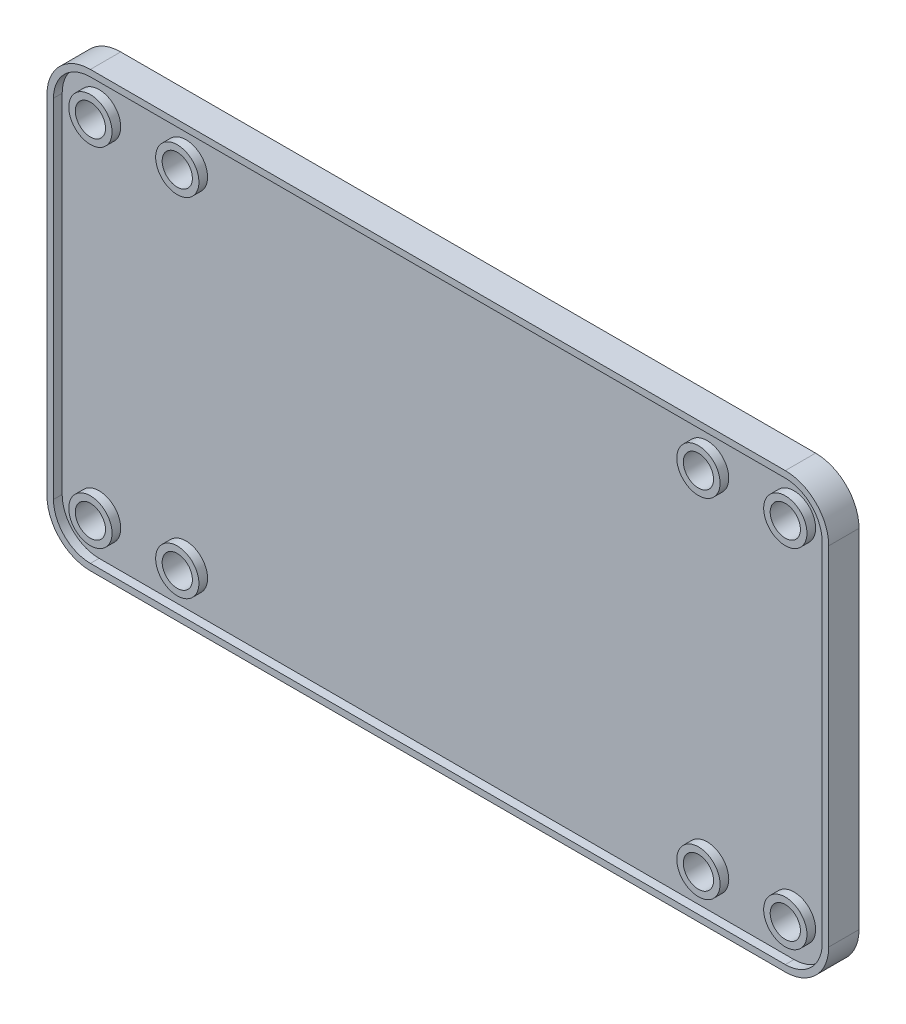
ISO-10303-21;
HEADER;
FILE_DESCRIPTION(('STEP AP214'),'2;1');
FILE_NAME('part.step','',(''),(''),'','','');
FILE_SCHEMA(('AUTOMOTIVE_DESIGN { 1 0 10303 214 1 1 1 1 }'));
ENDSEC;
DATA;
#1=APPLICATION_CONTEXT('core data for automotive mechanical design processes');
#2=APPLICATION_PROTOCOL_DEFINITION('international standard','automotive_design',2000,#1);
#3=PRODUCT_CONTEXT('',#1,'mechanical');
#4=PRODUCT('Part','Part','',(#3));
#5=PRODUCT_RELATED_PRODUCT_CATEGORY('part','',(#4));
#6=PRODUCT_DEFINITION_FORMATION('','',#4);
#7=PRODUCT_DEFINITION_CONTEXT('part definition',#1,'design');
#8=PRODUCT_DEFINITION('design','',#6,#7);
#9=PRODUCT_DEFINITION_SHAPE('','',#8);
#10=(LENGTH_UNIT() NAMED_UNIT(*) SI_UNIT(.MILLI.,.METRE.));
#11=(NAMED_UNIT(*) PLANE_ANGLE_UNIT() SI_UNIT($,.RADIAN.));
#12=(NAMED_UNIT(*) SI_UNIT($,.STERADIAN.) SOLID_ANGLE_UNIT());
#13=UNCERTAINTY_MEASURE_WITH_UNIT(LENGTH_MEASURE(1.E-05),#10,'distance_accuracy_value','');
#14=(GEOMETRIC_REPRESENTATION_CONTEXT(3) GLOBAL_UNCERTAINTY_ASSIGNED_CONTEXT((#13)) GLOBAL_UNIT_ASSIGNED_CONTEXT((#10,
#11,#12)) REPRESENTATION_CONTEXT('',''));
#15=CARTESIAN_POINT('',(0.,0.,0.));
#16=DIRECTION('',(0.,0.,1.));
#17=DIRECTION('',(1.,0.,0.));
#18=AXIS2_PLACEMENT_3D('',#15,#16,#17);
#19=CARTESIAN_POINT('',(50.8,25.4,0.));
#20=DIRECTION('',(0.,0.,-1.));
#21=DIRECTION('',(-1.,0.,0.));
#22=AXIS2_PLACEMENT_3D('',#19,#20,#21);
#23=PLANE('',#22);
#24=CARTESIAN_POINT('',(38.1,25.4,0.));
#25=DIRECTION('',(0.,0.,1.));
#26=DIRECTION('',(1.,0.,0.));
#27=AXIS2_PLACEMENT_3D('',#24,#25,#26);
#28=CIRCLE('',#27,2.2098);
#29=CARTESIAN_POINT('',(40.3098,25.4,0.));
#30=VERTEX_POINT('',#29);
#31=EDGE_CURVE('E313',#30,#30,#28,.T.);
#32=ORIENTED_EDGE('',*,*,#31,.F.);
#33=EDGE_LOOP('',(#32));
#34=FACE_BOUND('',#33,.T.);
#35=CARTESIAN_POINT('',(38.1,25.4,0.));
#36=DIRECTION('',(0.,0.,1.));
#37=DIRECTION('',(1.,0.,0.));
#38=AXIS2_PLACEMENT_3D('',#35,#36,#37);
#39=CIRCLE('',#38,3.1623);
#40=CARTESIAN_POINT('',(41.2623,25.4,0.));
#41=VERTEX_POINT('',#40);
#42=EDGE_CURVE('E237',#41,#41,#39,.T.);
#43=ORIENTED_EDGE('',*,*,#42,.T.);
#44=EDGE_LOOP('',(#43));
#45=FACE_BOUND('',#44,.T.);
#46=ADVANCED_FACE('F45',(#34,#45),#23,.F.);
#47=CARTESIAN_POINT('',(50.8,25.4,0.));
#48=DIRECTION('',(0.,0.,1.));
#49=DIRECTION('',(1.,0.,0.));
#50=AXIS2_PLACEMENT_3D('',#47,#48,#49);
#51=CIRCLE('',#50,2.2098);
#52=CARTESIAN_POINT('',(53.0098,25.4,0.));
#53=VERTEX_POINT('',#52);
#54=EDGE_CURVE('E316',#53,#53,#51,.T.);
#55=ORIENTED_EDGE('',*,*,#54,.F.);
#56=EDGE_LOOP('',(#55));
#57=FACE_BOUND('',#56,.T.);
#58=CARTESIAN_POINT('',(50.8,25.4,0.));
#59=DIRECTION('',(0.,0.,1.));
#60=DIRECTION('',(1.,0.,0.));
#61=AXIS2_PLACEMENT_3D('',#58,#59,#60);
#62=CIRCLE('',#61,3.1623);
#63=CARTESIAN_POINT('',(53.9623,25.4,0.));
#64=VERTEX_POINT('',#63);
#65=EDGE_CURVE('E231',#64,#64,#62,.T.);
#66=ORIENTED_EDGE('',*,*,#65,.T.);
#67=EDGE_LOOP('',(#66));
#68=FACE_BOUND('',#67,.T.);
#69=ADVANCED_FACE('F393',(#57,#68),#23,.F.);
#70=CARTESIAN_POINT('',(50.8,-25.4,0.));
#71=DIRECTION('',(0.,0.,1.));
#72=DIRECTION('',(-1.,0.,0.));
#73=AXIS2_PLACEMENT_3D('',#70,#71,#72);
#74=CIRCLE('',#73,2.2098);
#75=CARTESIAN_POINT('',(48.5902,-25.4,0.));
#76=VERTEX_POINT('',#75);
#77=EDGE_CURVE('E310',#76,#76,#74,.T.);
#78=ORIENTED_EDGE('',*,*,#77,.F.);
#79=EDGE_LOOP('',(#78));
#80=FACE_BOUND('',#79,.T.);
#81=CARTESIAN_POINT('',(50.8,-25.4,0.));
#82=DIRECTION('',(0.,0.,1.));
#83=DIRECTION('',(1.,0.,0.));
#84=AXIS2_PLACEMENT_3D('',#81,#82,#83);
#85=CIRCLE('',#84,3.1623);
#86=CARTESIAN_POINT('',(53.9623,-25.4,0.));
#87=VERTEX_POINT('',#86);
#88=EDGE_CURVE('E225',#87,#87,#85,.T.);
#89=ORIENTED_EDGE('',*,*,#88,.T.);
#90=EDGE_LOOP('',(#89));
#91=FACE_BOUND('',#90,.T.);
#92=ADVANCED_FACE('F399',(#80,#91),#23,.F.);
#93=CARTESIAN_POINT('',(38.1,-25.4,0.));
#94=DIRECTION('',(0.,0.,1.));
#95=DIRECTION('',(-1.,0.,0.));
#96=AXIS2_PLACEMENT_3D('',#93,#94,#95);
#97=CIRCLE('',#96,2.2098);
#98=CARTESIAN_POINT('',(35.8902,-25.4,0.));
#99=VERTEX_POINT('',#98);
#100=EDGE_CURVE('E294',#99,#99,#97,.T.);
#101=ORIENTED_EDGE('',*,*,#100,.F.);
#102=EDGE_LOOP('',(#101));
#103=FACE_BOUND('',#102,.T.);
#104=CARTESIAN_POINT('',(38.1,-25.4,0.));
#105=DIRECTION('',(0.,0.,1.));
#106=DIRECTION('',(1.,0.,0.));
#107=AXIS2_PLACEMENT_3D('',#104,#105,#106);
#108=CIRCLE('',#107,3.1623);
#109=CARTESIAN_POINT('',(41.2623,-25.4,0.));
#110=VERTEX_POINT('',#109);
#111=EDGE_CURVE('E219',#110,#110,#108,.T.);
#112=ORIENTED_EDGE('',*,*,#111,.T.);
#113=EDGE_LOOP('',(#112));
#114=FACE_BOUND('',#113,.T.);
#115=ADVANCED_FACE('F575',(#103,#114),#23,.F.);
#116=CARTESIAN_POINT('',(-38.1,-25.4,0.));
#117=DIRECTION('',(0.,0.,1.));
#118=DIRECTION('',(1.,0.,0.));
#119=AXIS2_PLACEMENT_3D('',#116,#117,#118);
#120=CIRCLE('',#119,2.2098);
#121=CARTESIAN_POINT('',(-35.8902,-25.4,0.));
#122=VERTEX_POINT('',#121);
#123=EDGE_CURVE('E325',#122,#122,#120,.T.);
#124=ORIENTED_EDGE('',*,*,#123,.F.);
#125=EDGE_LOOP('',(#124));
#126=FACE_BOUND('',#125,.T.);
#127=CARTESIAN_POINT('',(-38.1,-25.4,0.));
#128=DIRECTION('',(0.,0.,1.));
#129=DIRECTION('',(1.,0.,0.));
#130=AXIS2_PLACEMENT_3D('',#127,#128,#129);
#131=CIRCLE('',#130,3.1623);
#132=CARTESIAN_POINT('',(-34.9377,-25.4,0.));
#133=VERTEX_POINT('',#132);
#134=EDGE_CURVE('E213',#133,#133,#131,.T.);
#135=ORIENTED_EDGE('',*,*,#134,.T.);
#136=EDGE_LOOP('',(#135));
#137=FACE_BOUND('',#136,.T.);
#138=ADVANCED_FACE('F572',(#126,#137),#23,.F.);
#139=CARTESIAN_POINT('',(-50.8,-25.4,0.));
#140=DIRECTION('',(0.,0.,1.));
#141=DIRECTION('',(1.,0.,0.));
#142=AXIS2_PLACEMENT_3D('',#139,#140,#141);
#143=CIRCLE('',#142,2.2098);
#144=CARTESIAN_POINT('',(-48.5902,-25.4,0.));
#145=VERTEX_POINT('',#144);
#146=EDGE_CURVE('E328',#145,#145,#143,.T.);
#147=ORIENTED_EDGE('',*,*,#146,.F.);
#148=EDGE_LOOP('',(#147));
#149=FACE_BOUND('',#148,.T.);
#150=CARTESIAN_POINT('',(-50.8,-25.4,0.));
#151=DIRECTION('',(0.,0.,1.));
#152=DIRECTION('',(1.,0.,0.));
#153=AXIS2_PLACEMENT_3D('',#150,#151,#152);
#154=CIRCLE('',#153,3.1623);
#155=CARTESIAN_POINT('',(-47.6377,-25.4,0.));
#156=VERTEX_POINT('',#155);
#157=EDGE_CURVE('E207',#156,#156,#154,.T.);
#158=ORIENTED_EDGE('',*,*,#157,.T.);
#159=EDGE_LOOP('',(#158));
#160=FACE_BOUND('',#159,.T.);
#161=ADVANCED_FACE('F423',(#149,#160),#23,.F.);
#162=CARTESIAN_POINT('',(-38.1,25.4,0.));
#163=DIRECTION('',(0.,0.,1.));
#164=DIRECTION('',(-1.,0.,0.));
#165=AXIS2_PLACEMENT_3D('',#162,#163,#164);
#166=CIRCLE('',#165,2.2098);
#167=CARTESIAN_POINT('',(-40.3098,25.4,0.));
#168=VERTEX_POINT('',#167);
#169=EDGE_CURVE('E319',#168,#168,#166,.T.);
#170=ORIENTED_EDGE('',*,*,#169,.F.);
#171=EDGE_LOOP('',(#170));
#172=FACE_BOUND('',#171,.T.);
#173=CARTESIAN_POINT('',(-38.1,25.4,0.));
#174=DIRECTION('',(0.,0.,1.));
#175=DIRECTION('',(1.,0.,0.));
#176=AXIS2_PLACEMENT_3D('',#173,#174,#175);
#177=CIRCLE('',#176,3.1623);
#178=CARTESIAN_POINT('',(-34.9377,25.4,0.));
#179=VERTEX_POINT('',#178);
#180=EDGE_CURVE('E201',#179,#179,#177,.T.);
#181=ORIENTED_EDGE('',*,*,#180,.T.);
#182=EDGE_LOOP('',(#181));
#183=FACE_BOUND('',#182,.T.);
#184=ADVANCED_FACE('F417',(#172,#183),#23,.F.);
#185=CARTESIAN_POINT('',(-50.8,25.4,0.));
#186=DIRECTION('',(0.,0.,1.));
#187=DIRECTION('',(-1.,0.,0.));
#188=AXIS2_PLACEMENT_3D('',#185,#186,#187);
#189=CIRCLE('',#188,2.2098);
#190=CARTESIAN_POINT('',(-53.0098,25.4,0.));
#191=VERTEX_POINT('',#190);
#192=EDGE_CURVE('E322',#191,#191,#189,.T.);
#193=ORIENTED_EDGE('',*,*,#192,.F.);
#194=EDGE_LOOP('',(#193));
#195=FACE_BOUND('',#194,.T.);
#196=CARTESIAN_POINT('',(-50.8,25.4,0.));
#197=DIRECTION('',(0.,0.,1.));
#198=DIRECTION('',(1.,0.,0.));
#199=AXIS2_PLACEMENT_3D('',#196,#197,#198);
#200=CIRCLE('',#199,3.1623);
#201=CARTESIAN_POINT('',(-47.6377,25.4,0.));
#202=VERTEX_POINT('',#201);
#203=EDGE_CURVE('E197',#202,#202,#200,.T.);
#204=ORIENTED_EDGE('',*,*,#203,.T.);
#205=EDGE_LOOP('',(#204));
#206=FACE_BOUND('',#205,.T.);
#207=ADVANCED_FACE('F408',(#195,#206),#23,.F.);
#208=CARTESIAN_POINT('',(50.8,25.4,-3.175));
#209=DIRECTION('',(0.,0.,1.));
#210=DIRECTION('',(1.,0.,0.));
#211=AXIS2_PLACEMENT_3D('',#208,#209,#210);
#212=CYLINDRICAL_SURFACE('',#211,6.35);
#213=CARTESIAN_POINT('',(50.8,25.4,0.));
#214=DIRECTION('',(0.,0.,1.));
#215=DIRECTION('',(-1.,0.,0.));
#216=AXIS2_PLACEMENT_3D('',#213,#214,#215);
#217=CIRCLE('',#216,6.35);
#218=CARTESIAN_POINT('',(57.15,25.4,0.));
#219=VERTEX_POINT('',#218);
#220=CARTESIAN_POINT('',(50.8,31.75,0.));
#221=VERTEX_POINT('',#220);
#222=EDGE_CURVE('E161',#219,#221,#217,.T.);
#223=ORIENTED_EDGE('',*,*,#222,.F.);
#224=DIRECTION('',(0.,0.,1.));
#225=VECTOR('',#224,1.);
#226=CARTESIAN_POINT('',(57.15,25.4,-3.175));
#227=LINE('',#226,#225);
#228=CARTESIAN_POINT('',(57.15,25.4,-4.428000034));
#229=VERTEX_POINT('',#228);
#230=EDGE_CURVE('E11',#229,#219,#227,.T.);
#231=ORIENTED_EDGE('',*,*,#230,.F.);
#232=CARTESIAN_POINT('',(50.8,25.4,-4.428000034));
#233=DIRECTION('',(0.,0.,-1.));
#234=DIRECTION('',(-1.,0.,0.));
#235=AXIS2_PLACEMENT_3D('',#232,#233,#234);
#236=CIRCLE('',#235,6.35);
#237=CARTESIAN_POINT('',(50.8,31.75,-4.428000034));
#238=VERTEX_POINT('',#237);
#239=EDGE_CURVE('E159',#238,#229,#236,.T.);
#240=ORIENTED_EDGE('',*,*,#239,.F.);
#241=DIRECTION('',(0.,0.,1.));
#242=VECTOR('',#241,1.);
#243=CARTESIAN_POINT('',(50.8,31.75,-3.175));
#244=LINE('',#243,#242);
#245=EDGE_CURVE('E49',#238,#221,#244,.T.);
#246=ORIENTED_EDGE('',*,*,#245,.T.);
#247=EDGE_LOOP('',(#223,#231,#240,#246));
#248=FACE_BOUND('',#247,.T.);
#249=ADVANCED_FACE('F47',(#248),#212,.T.);
#250=CARTESIAN_POINT('',(57.15,-25.4,-3.175));
#251=DIRECTION('',(1.,0.,0.));
#252=DIRECTION('',(0.,0.,-1.));
#253=AXIS2_PLACEMENT_3D('',#250,#251,#252);
#254=PLANE('',#253);
#255=DIRECTION('',(0.,1.,0.));
#256=VECTOR('',#255,1.);
#257=CARTESIAN_POINT('',(57.15,-25.4,0.));
#258=LINE('',#257,#256);
#259=CARTESIAN_POINT('',(57.15,-25.4,0.));
#260=VERTEX_POINT('',#259);
#261=EDGE_CURVE('E350',#260,#219,#258,.T.);
#262=ORIENTED_EDGE('',*,*,#261,.F.);
#263=DIRECTION('',(0.,0.,1.));
#264=VECTOR('',#263,1.);
#265=CARTESIAN_POINT('',(57.15,-25.4,-3.175));
#266=LINE('',#265,#264);
#267=CARTESIAN_POINT('',(57.15,-25.4,-4.428000034));
#268=VERTEX_POINT('',#267);
#269=EDGE_CURVE('E54',#268,#260,#266,.T.);
#270=ORIENTED_EDGE('',*,*,#269,.F.);
#271=DIRECTION('',(0.,-1.,0.));
#272=VECTOR('',#271,1.);
#273=CARTESIAN_POINT('',(57.15,25.4,-4.428000034));
#274=LINE('',#273,#272);
#275=EDGE_CURVE('E164',#229,#268,#274,.T.);
#276=ORIENTED_EDGE('',*,*,#275,.F.);
#277=ORIENTED_EDGE('',*,*,#230,.T.);
#278=EDGE_LOOP('',(#262,#270,#276,#277));
#279=FACE_BOUND('',#278,.T.);
#280=ADVANCED_FACE('F165',(#279),#254,.T.);
#281=CARTESIAN_POINT('',(50.8,-25.4,-3.175));
#282=DIRECTION('',(0.,0.,1.));
#283=DIRECTION('',(1.,0.,0.));
#284=AXIS2_PLACEMENT_3D('',#281,#282,#283);
#285=CYLINDRICAL_SURFACE('',#284,6.35);
#286=CARTESIAN_POINT('',(50.8,-25.4,0.));
#287=DIRECTION('',(0.,0.,1.));
#288=DIRECTION('',(1.,0.,0.));
#289=AXIS2_PLACEMENT_3D('',#286,#287,#288);
#290=CIRCLE('',#289,6.35);
#291=CARTESIAN_POINT('',(50.8,-31.75,0.));
#292=VERTEX_POINT('',#291);
#293=EDGE_CURVE('E347',#292,#260,#290,.T.);
#294=ORIENTED_EDGE('',*,*,#293,.F.);
#295=DIRECTION('',(0.,0.,1.));
#296=VECTOR('',#295,1.);
#297=CARTESIAN_POINT('',(50.8,-31.75,-3.175));
#298=LINE('',#297,#296);
#299=CARTESIAN_POINT('',(50.8,-31.75,-4.428000034));
#300=VERTEX_POINT('',#299);
#301=EDGE_CURVE('E353',#300,#292,#298,.T.);
#302=ORIENTED_EDGE('',*,*,#301,.F.);
#303=CARTESIAN_POINT('',(50.8,-25.4,-4.428000034));
#304=DIRECTION('',(0.,0.,-1.));
#305=DIRECTION('',(-1.,0.,0.));
#306=AXIS2_PLACEMENT_3D('',#303,#304,#305);
#307=CIRCLE('',#306,6.35);
#308=EDGE_CURVE('E169',#268,#300,#307,.T.);
#309=ORIENTED_EDGE('',*,*,#308,.F.);
#310=ORIENTED_EDGE('',*,*,#269,.T.);
#311=EDGE_LOOP('',(#294,#302,#309,#310));
#312=FACE_BOUND('',#311,.T.);
#313=ADVANCED_FACE('F370',(#312),#285,.T.);
#314=CARTESIAN_POINT('',(-50.7999999999999,-31.75,-3.175));
#315=DIRECTION('',(0.,-1.,0.));
#316=DIRECTION('',(0.,0.,-1.));
#317=AXIS2_PLACEMENT_3D('',#314,#315,#316);
#318=PLANE('',#317);
#319=DIRECTION('',(1.,0.,0.));
#320=VECTOR('',#319,1.);
#321=CARTESIAN_POINT('',(-50.7999999999999,-31.75,0.));
#322=LINE('',#321,#320);
#323=CARTESIAN_POINT('',(-50.7999999999999,-31.75,0.));
#324=VERTEX_POINT('',#323);
#325=EDGE_CURVE('E344',#324,#292,#322,.T.);
#326=ORIENTED_EDGE('',*,*,#325,.F.);
#327=DIRECTION('',(0.,0.,1.));
#328=VECTOR('',#327,1.);
#329=CARTESIAN_POINT('',(-50.7999999999999,-31.75,-3.175));
#330=LINE('',#329,#328);
#331=CARTESIAN_POINT('',(-50.7999999999999,-31.75,-4.428000034));
#332=VERTEX_POINT('',#331);
#333=EDGE_CURVE('E355',#332,#324,#330,.T.);
#334=ORIENTED_EDGE('',*,*,#333,.F.);
#335=DIRECTION('',(-1.,0.,0.));
#336=VECTOR('',#335,1.);
#337=CARTESIAN_POINT('',(50.8,-31.75,-4.428000034));
#338=LINE('',#337,#336);
#339=EDGE_CURVE('E185',#300,#332,#338,.T.);
#340=ORIENTED_EDGE('',*,*,#339,.F.);
#341=ORIENTED_EDGE('',*,*,#301,.T.);
#342=EDGE_LOOP('',(#326,#334,#340,#341));
#343=FACE_BOUND('',#342,.T.);
#344=ADVANCED_FACE('F374',(#343),#318,.T.);
#345=CARTESIAN_POINT('',(-50.8,-25.4,-3.175));
#346=DIRECTION('',(0.,0.,1.));
#347=DIRECTION('',(1.,0.,0.));
#348=AXIS2_PLACEMENT_3D('',#345,#346,#347);
#349=CYLINDRICAL_SURFACE('',#348,6.35);
#350=CARTESIAN_POINT('',(-50.8,-25.4,0.));
#351=DIRECTION('',(0.,0.,1.));
#352=DIRECTION('',(-1.,0.,0.));
#353=AXIS2_PLACEMENT_3D('',#350,#351,#352);
#354=CIRCLE('',#353,6.35);
#355=CARTESIAN_POINT('',(-57.15,-25.4,0.));
#356=VERTEX_POINT('',#355);
#357=EDGE_CURVE('E341',#356,#324,#354,.T.);
#358=ORIENTED_EDGE('',*,*,#357,.F.);
#359=DIRECTION('',(0.,0.,1.));
#360=VECTOR('',#359,1.);
#361=CARTESIAN_POINT('',(-57.15,-25.4,-3.175));
#362=LINE('',#361,#360);
#363=CARTESIAN_POINT('',(-57.15,-25.4,-4.428000034));
#364=VERTEX_POINT('',#363);
#365=EDGE_CURVE('E357',#364,#356,#362,.T.);
#366=ORIENTED_EDGE('',*,*,#365,.F.);
#367=CARTESIAN_POINT('',(-50.8,-25.4,-4.428000034));
#368=DIRECTION('',(0.,0.,-1.));
#369=DIRECTION('',(-1.,0.,0.));
#370=AXIS2_PLACEMENT_3D('',#367,#368,#369);
#371=CIRCLE('',#370,6.35);
#372=EDGE_CURVE('E188',#332,#364,#371,.T.);
#373=ORIENTED_EDGE('',*,*,#372,.F.);
#374=ORIENTED_EDGE('',*,*,#333,.T.);
#375=EDGE_LOOP('',(#358,#366,#373,#374));
#376=FACE_BOUND('',#375,.T.);
#377=ADVANCED_FACE('F377',(#376),#349,.T.);
#378=CARTESIAN_POINT('',(-57.15,-25.4,-3.175));
#379=DIRECTION('',(-1.,0.,0.));
#380=DIRECTION('',(0.,0.,1.));
#381=AXIS2_PLACEMENT_3D('',#378,#379,#380);
#382=PLANE('',#381);
#383=DIRECTION('',(0.,-1.,0.));
#384=VECTOR('',#383,1.);
#385=CARTESIAN_POINT('',(-57.15,-25.4,0.));
#386=LINE('',#385,#384);
#387=CARTESIAN_POINT('',(-57.15,25.4,0.));
#388=VERTEX_POINT('',#387);
#389=EDGE_CURVE('E338',#388,#356,#386,.T.);
#390=ORIENTED_EDGE('',*,*,#389,.F.);
#391=DIRECTION('',(0.,0.,1.));
#392=VECTOR('',#391,1.);
#393=CARTESIAN_POINT('',(-57.15,25.4,-3.175));
#394=LINE('',#393,#392);
#395=CARTESIAN_POINT('',(-57.15,25.4,-4.428000034));
#396=VERTEX_POINT('',#395);
#397=EDGE_CURVE('E359',#396,#388,#394,.T.);
#398=ORIENTED_EDGE('',*,*,#397,.F.);
#399=DIRECTION('',(0.,1.,0.));
#400=VECTOR('',#399,1.);
#401=CARTESIAN_POINT('',(-57.15,-25.4,-4.428000034));
#402=LINE('',#401,#400);
#403=EDGE_CURVE('E191',#364,#396,#402,.T.);
#404=ORIENTED_EDGE('',*,*,#403,.F.);
#405=ORIENTED_EDGE('',*,*,#365,.T.);
#406=EDGE_LOOP('',(#390,#398,#404,#405));
#407=FACE_BOUND('',#406,.T.);
#408=ADVANCED_FACE('F382',(#407),#382,.T.);
#409=CARTESIAN_POINT('',(-50.8,25.4,-3.175));
#410=DIRECTION('',(0.,0.,1.));
#411=DIRECTION('',(1.,0.,0.));
#412=AXIS2_PLACEMENT_3D('',#409,#410,#411);
#413=CYLINDRICAL_SURFACE('',#412,6.35);
#414=CARTESIAN_POINT('',(-50.8,25.4,0.));
#415=DIRECTION('',(0.,0.,1.));
#416=DIRECTION('',(-1.,0.,0.));
#417=AXIS2_PLACEMENT_3D('',#414,#415,#416);
#418=CIRCLE('',#417,6.35);
#419=CARTESIAN_POINT('',(-50.7999999999999,31.75,0.));
#420=VERTEX_POINT('',#419);
#421=EDGE_CURVE('E335',#420,#388,#418,.T.);
#422=ORIENTED_EDGE('',*,*,#421,.F.);
#423=DIRECTION('',(0.,0.,1.));
#424=VECTOR('',#423,1.);
#425=CARTESIAN_POINT('',(-50.7999999999999,31.75,-3.175));
#426=LINE('',#425,#424);
#427=CARTESIAN_POINT('',(-50.7999999999999,31.75,-4.428000034));
#428=VERTEX_POINT('',#427);
#429=EDGE_CURVE('E360',#428,#420,#426,.T.);
#430=ORIENTED_EDGE('',*,*,#429,.F.);
#431=CARTESIAN_POINT('',(-50.8,25.4,-4.428000034));
#432=DIRECTION('',(0.,0.,-1.));
#433=DIRECTION('',(-1.,0.,0.));
#434=AXIS2_PLACEMENT_3D('',#431,#432,#433);
#435=CIRCLE('',#434,6.35);
#436=EDGE_CURVE('E194',#396,#428,#435,.T.);
#437=ORIENTED_EDGE('',*,*,#436,.F.);
#438=ORIENTED_EDGE('',*,*,#397,.T.);
#439=EDGE_LOOP('',(#422,#430,#437,#438));
#440=FACE_BOUND('',#439,.T.);
#441=ADVANCED_FACE('F384',(#440),#413,.T.);
#442=CARTESIAN_POINT('',(-50.7999999999999,31.75,-3.175));
#443=DIRECTION('',(0.,1.,0.));
#444=DIRECTION('',(0.,0.,1.));
#445=AXIS2_PLACEMENT_3D('',#442,#443,#444);
#446=PLANE('',#445);
#447=DIRECTION('',(-1.,0.,0.));
#448=VECTOR('',#447,1.);
#449=CARTESIAN_POINT('',(-50.7999999999999,31.75,0.));
#450=LINE('',#449,#448);
#451=EDGE_CURVE('E332',#221,#420,#450,.T.);
#452=ORIENTED_EDGE('',*,*,#451,.F.);
#453=ORIENTED_EDGE('',*,*,#245,.F.);
#454=DIRECTION('',(1.,0.,0.));
#455=VECTOR('',#454,1.);
#456=CARTESIAN_POINT('',(-50.7999999999999,31.75,-4.428000034));
#457=LINE('',#456,#455);
#458=EDGE_CURVE('E176',#428,#238,#457,.T.);
#459=ORIENTED_EDGE('',*,*,#458,.F.);
#460=ORIENTED_EDGE('',*,*,#429,.T.);
#461=EDGE_LOOP('',(#452,#453,#459,#460));
#462=FACE_BOUND('',#461,.T.);
#463=ADVANCED_FACE('F364',(#462),#446,.T.);
#464=DIRECTION('',(-1.,0.,0.));
#465=VECTOR('',#464,1.);
#466=CARTESIAN_POINT('',(50.8,30.7975,0.));
#467=LINE('',#466,#465);
#468=CARTESIAN_POINT('',(50.8,30.7975,0.));
#469=VERTEX_POINT('',#468);
#470=CARTESIAN_POINT('',(-50.7999999999999,30.7975,0.));
#471=VERTEX_POINT('',#470);
#472=EDGE_CURVE('E272',#469,#471,#467,.T.);
#473=ORIENTED_EDGE('',*,*,#472,.F.);
#474=CARTESIAN_POINT('',(50.8,25.4,0.));
#475=DIRECTION('',(0.,0.,1.));
#476=DIRECTION('',(1.,0.,0.));
#477=AXIS2_PLACEMENT_3D('',#474,#475,#476);
#478=CIRCLE('',#477,5.3975);
#479=CARTESIAN_POINT('',(56.1975,25.4,0.));
#480=VERTEX_POINT('',#479);
#481=EDGE_CURVE('E62',#480,#469,#478,.T.);
#482=ORIENTED_EDGE('',*,*,#481,.F.);
#483=DIRECTION('',(0.,1.,0.));
#484=VECTOR('',#483,1.);
#485=CARTESIAN_POINT('',(56.1975,-25.4,0.));
#486=LINE('',#485,#484);
#487=CARTESIAN_POINT('',(56.1975,-25.4,0.));
#488=VERTEX_POINT('',#487);
#489=EDGE_CURVE('E249',#488,#480,#486,.T.);
#490=ORIENTED_EDGE('',*,*,#489,.F.);
#491=CARTESIAN_POINT('',(50.8,-25.4,0.));
#492=DIRECTION('',(0.,0.,1.));
#493=DIRECTION('',(1.,0.,0.));
#494=AXIS2_PLACEMENT_3D('',#491,#492,#493);
#495=CIRCLE('',#494,5.3975);
#496=CARTESIAN_POINT('',(50.7999999999999,-30.7975,0.));
#497=VERTEX_POINT('',#496);
#498=EDGE_CURVE('E287',#497,#488,#495,.T.);
#499=ORIENTED_EDGE('',*,*,#498,.F.);
#500=DIRECTION('',(1.,0.,0.));
#501=VECTOR('',#500,1.);
#502=CARTESIAN_POINT('',(-50.8,-30.7975,0.));
#503=LINE('',#502,#501);
#504=CARTESIAN_POINT('',(-50.8,-30.7975,0.));
#505=VERTEX_POINT('',#504);
#506=EDGE_CURVE('E284',#505,#497,#503,.T.);
#507=ORIENTED_EDGE('',*,*,#506,.F.);
#508=CARTESIAN_POINT('',(-50.8,-25.4,0.));
#509=DIRECTION('',(0.,0.,1.));
#510=DIRECTION('',(1.,0.,0.));
#511=AXIS2_PLACEMENT_3D('',#508,#509,#510);
#512=CIRCLE('',#511,5.39749999999999);
#513=CARTESIAN_POINT('',(-56.1975,-25.3999999999999,0.));
#514=VERTEX_POINT('',#513);
#515=EDGE_CURVE('E281',#514,#505,#512,.T.);
#516=ORIENTED_EDGE('',*,*,#515,.F.);
#517=DIRECTION('',(0.,-1.,0.));
#518=VECTOR('',#517,1.);
#519=CARTESIAN_POINT('',(-56.1975,25.4,0.));
#520=LINE('',#519,#518);
#521=CARTESIAN_POINT('',(-56.1975,25.4,0.));
#522=VERTEX_POINT('',#521);
#523=EDGE_CURVE('E278',#522,#514,#520,.T.);
#524=ORIENTED_EDGE('',*,*,#523,.F.);
#525=CARTESIAN_POINT('',(-50.8,25.4,0.));
#526=DIRECTION('',(0.,0.,1.));
#527=DIRECTION('',(1.,0.,0.));
#528=AXIS2_PLACEMENT_3D('',#525,#526,#527);
#529=CIRCLE('',#528,5.3975);
#530=EDGE_CURVE('E275',#471,#522,#529,.T.);
#531=ORIENTED_EDGE('',*,*,#530,.F.);
#532=EDGE_LOOP('',(#473,#482,#490,#499,#507,#516,#524,#531));
#533=FACE_BOUND('',#532,.T.);
#534=ORIENTED_EDGE('',*,*,#222,.T.);
#535=ORIENTED_EDGE('',*,*,#451,.T.);
#536=ORIENTED_EDGE('',*,*,#421,.T.);
#537=ORIENTED_EDGE('',*,*,#389,.T.);
#538=ORIENTED_EDGE('',*,*,#357,.T.);
#539=ORIENTED_EDGE('',*,*,#325,.T.);
#540=ORIENTED_EDGE('',*,*,#293,.T.);
#541=ORIENTED_EDGE('',*,*,#261,.T.);
#542=EDGE_LOOP('',(#534,#535,#536,#537,#538,#539,#540,#541));
#543=FACE_BOUND('',#542,.T.);
#544=ADVANCED_FACE('F366',(#533,#543),#23,.F.);
#545=CARTESIAN_POINT('',(-50.8,-25.4,-3.175));
#546=DIRECTION('',(0.,0.,1.));
#547=DIRECTION('',(1.,0.,0.));
#548=AXIS2_PLACEMENT_3D('',#545,#546,#547);
#549=CYLINDRICAL_SURFACE('',#548,2.2098);
#550=ORIENTED_EDGE('',*,*,#146,.T.);
#551=EDGE_LOOP('',(#550));
#552=FACE_BOUND('',#551,.T.);
#553=CARTESIAN_POINT('',(-50.8,-25.4,-4.428000034));
#554=DIRECTION('',(0.,0.,-1.));
#555=DIRECTION('',(-1.,0.,0.));
#556=AXIS2_PLACEMENT_3D('',#553,#554,#555);
#557=CIRCLE('',#556,2.2098);
#558=CARTESIAN_POINT('',(-53.0098,-25.4,-4.428000034));
#559=VERTEX_POINT('',#558);
#560=EDGE_CURVE('E535',#559,#559,#557,.T.);
#561=ORIENTED_EDGE('',*,*,#560,.T.);
#562=EDGE_LOOP('',(#561));
#563=FACE_BOUND('',#562,.T.);
#564=ADVANCED_FACE('F406',(#552,#563),#549,.F.);
#565=CARTESIAN_POINT('',(-38.1,-25.4,-3.175));
#566=DIRECTION('',(0.,0.,1.));
#567=DIRECTION('',(1.,0.,0.));
#568=AXIS2_PLACEMENT_3D('',#565,#566,#567);
#569=CYLINDRICAL_SURFACE('',#568,2.2098);
#570=ORIENTED_EDGE('',*,*,#123,.T.);
#571=EDGE_LOOP('',(#570));
#572=FACE_BOUND('',#571,.T.);
#573=CARTESIAN_POINT('',(-38.1,-25.4,-4.428000034));
#574=DIRECTION('',(0.,0.,-1.));
#575=DIRECTION('',(-1.,0.,0.));
#576=AXIS2_PLACEMENT_3D('',#573,#574,#575);
#577=CIRCLE('',#576,2.2098);
#578=CARTESIAN_POINT('',(-40.3098,-25.4,-4.428000034));
#579=VERTEX_POINT('',#578);
#580=EDGE_CURVE('E533',#579,#579,#577,.T.);
#581=ORIENTED_EDGE('',*,*,#580,.T.);
#582=EDGE_LOOP('',(#581));
#583=FACE_BOUND('',#582,.T.);
#584=ADVANCED_FACE('F414',(#572,#583),#569,.F.);
#585=CARTESIAN_POINT('',(-50.8,25.4,-3.175));
#586=DIRECTION('',(0.,0.,1.));
#587=DIRECTION('',(1.,0.,0.));
#588=AXIS2_PLACEMENT_3D('',#585,#586,#587);
#589=CYLINDRICAL_SURFACE('',#588,2.2098);
#590=ORIENTED_EDGE('',*,*,#192,.T.);
#591=EDGE_LOOP('',(#590));
#592=FACE_BOUND('',#591,.T.);
#593=CARTESIAN_POINT('',(-50.8,25.4,-4.428000034));
#594=DIRECTION('',(0.,0.,-1.));
#595=DIRECTION('',(-1.,0.,0.));
#596=AXIS2_PLACEMENT_3D('',#593,#594,#595);
#597=CIRCLE('',#596,2.2098);
#598=CARTESIAN_POINT('',(-53.0098,25.4,-4.428000034));
#599=VERTEX_POINT('',#598);
#600=EDGE_CURVE('E539',#599,#599,#597,.T.);
#601=ORIENTED_EDGE('',*,*,#600,.T.);
#602=EDGE_LOOP('',(#601));
#603=FACE_BOUND('',#602,.T.);
#604=ADVANCED_FACE('F520',(#592,#603),#589,.F.);
#605=CARTESIAN_POINT('',(-38.1,25.4,-3.175));
#606=DIRECTION('',(0.,0.,1.));
#607=DIRECTION('',(1.,0.,0.));
#608=AXIS2_PLACEMENT_3D('',#605,#606,#607);
#609=CYLINDRICAL_SURFACE('',#608,2.2098);
#610=ORIENTED_EDGE('',*,*,#169,.T.);
#611=EDGE_LOOP('',(#610));
#612=FACE_BOUND('',#611,.T.);
#613=CARTESIAN_POINT('',(-38.1,25.4,-4.428000034));
#614=DIRECTION('',(0.,0.,-1.));
#615=DIRECTION('',(-1.,0.,0.));
#616=AXIS2_PLACEMENT_3D('',#613,#614,#615);
#617=CIRCLE('',#616,2.2098);
#618=CARTESIAN_POINT('',(-40.3098,25.4,-4.428000034));
#619=VERTEX_POINT('',#618);
#620=EDGE_CURVE('E544',#619,#619,#617,.T.);
#621=ORIENTED_EDGE('',*,*,#620,.T.);
#622=EDGE_LOOP('',(#621));
#623=FACE_BOUND('',#622,.T.);
#624=ADVANCED_FACE('F516',(#612,#623),#609,.F.);
#625=CARTESIAN_POINT('',(50.8,25.4,-3.175));
#626=DIRECTION('',(0.,0.,1.));
#627=DIRECTION('',(1.,0.,0.));
#628=AXIS2_PLACEMENT_3D('',#625,#626,#627);
#629=CYLINDRICAL_SURFACE('',#628,2.2098);
#630=ORIENTED_EDGE('',*,*,#54,.T.);
#631=EDGE_LOOP('',(#630));
#632=FACE_BOUND('',#631,.T.);
#633=CARTESIAN_POINT('',(50.8,25.4,-4.428000034));
#634=DIRECTION('',(0.,0.,-1.));
#635=DIRECTION('',(-1.,0.,0.));
#636=AXIS2_PLACEMENT_3D('',#633,#634,#635);
#637=CIRCLE('',#636,2.2098);
#638=CARTESIAN_POINT('',(48.5902,25.4,-4.428000034));
#639=VERTEX_POINT('',#638);
#640=EDGE_CURVE('E550',#639,#639,#637,.T.);
#641=ORIENTED_EDGE('',*,*,#640,.T.);
#642=EDGE_LOOP('',(#641));
#643=FACE_BOUND('',#642,.T.);
#644=ADVANCED_FACE('F512',(#632,#643),#629,.F.);
#645=CARTESIAN_POINT('',(38.1,25.4,-3.175));
#646=DIRECTION('',(0.,0.,1.));
#647=DIRECTION('',(1.,0.,0.));
#648=AXIS2_PLACEMENT_3D('',#645,#646,#647);
#649=CYLINDRICAL_SURFACE('',#648,2.2098);
#650=ORIENTED_EDGE('',*,*,#31,.T.);
#651=EDGE_LOOP('',(#650));
#652=FACE_BOUND('',#651,.T.);
#653=CARTESIAN_POINT('',(38.1,25.4,-4.428000034));
#654=DIRECTION('',(0.,0.,-1.));
#655=DIRECTION('',(-1.,0.,0.));
#656=AXIS2_PLACEMENT_3D('',#653,#654,#655);
#657=CIRCLE('',#656,2.2098);
#658=CARTESIAN_POINT('',(35.8902,25.4,-4.428000034));
#659=VERTEX_POINT('',#658);
#660=EDGE_CURVE('E547',#659,#659,#657,.T.);
#661=ORIENTED_EDGE('',*,*,#660,.T.);
#662=EDGE_LOOP('',(#661));
#663=FACE_BOUND('',#662,.T.);
#664=ADVANCED_FACE('F508',(#652,#663),#649,.F.);
#665=CARTESIAN_POINT('',(50.8,-25.4,-3.175));
#666=DIRECTION('',(0.,0.,1.));
#667=DIRECTION('',(1.,0.,0.));
#668=AXIS2_PLACEMENT_3D('',#665,#666,#667);
#669=CYLINDRICAL_SURFACE('',#668,2.2098);
#670=ORIENTED_EDGE('',*,*,#77,.T.);
#671=EDGE_LOOP('',(#670));
#672=FACE_BOUND('',#671,.T.);
#673=CARTESIAN_POINT('',(50.8,-25.4,-4.428000034));
#674=DIRECTION('',(0.,0.,-1.));
#675=DIRECTION('',(-1.,0.,0.));
#676=AXIS2_PLACEMENT_3D('',#673,#674,#675);
#677=CIRCLE('',#676,2.2098);
#678=CARTESIAN_POINT('',(48.5902,-25.4,-4.428000034));
#679=VERTEX_POINT('',#678);
#680=EDGE_CURVE('E177',#679,#679,#677,.T.);
#681=ORIENTED_EDGE('',*,*,#680,.T.);
#682=EDGE_LOOP('',(#681));
#683=FACE_BOUND('',#682,.T.);
#684=ADVANCED_FACE('F504',(#672,#683),#669,.F.);
#685=CARTESIAN_POINT('',(38.1,-25.4,-3.175));
#686=DIRECTION('',(0.,0.,1.));
#687=DIRECTION('',(1.,0.,0.));
#688=AXIS2_PLACEMENT_3D('',#685,#686,#687);
#689=CYLINDRICAL_SURFACE('',#688,2.2098);
#690=ORIENTED_EDGE('',*,*,#100,.T.);
#691=EDGE_LOOP('',(#690));
#692=FACE_BOUND('',#691,.T.);
#693=CARTESIAN_POINT('',(38.1,-25.4,-4.428000034));
#694=DIRECTION('',(0.,0.,-1.));
#695=DIRECTION('',(-1.,0.,0.));
#696=AXIS2_PLACEMENT_3D('',#693,#694,#695);
#697=CIRCLE('',#696,2.2098);
#698=CARTESIAN_POINT('',(35.8902,-25.4,-4.428000034));
#699=VERTEX_POINT('',#698);
#700=EDGE_CURVE('E180',#699,#699,#697,.T.);
#701=ORIENTED_EDGE('',*,*,#700,.T.);
#702=EDGE_LOOP('',(#701));
#703=FACE_BOUND('',#702,.T.);
#704=ADVANCED_FACE('F501',(#692,#703),#689,.F.);
#705=CARTESIAN_POINT('',(50.8,25.4,-1.27));
#706=DIRECTION('',(0.,0.,1.));
#707=DIRECTION('',(1.,0.,0.));
#708=AXIS2_PLACEMENT_3D('',#705,#706,#707);
#709=CYLINDRICAL_SURFACE('',#708,5.3975);
#710=ORIENTED_EDGE('',*,*,#481,.T.);
#711=DIRECTION('',(0.,0.,1.));
#712=VECTOR('',#711,1.);
#713=CARTESIAN_POINT('',(50.8,30.7975,-1.27));
#714=LINE('',#713,#712);
#715=CARTESIAN_POINT('',(50.8,30.7975,-1.27));
#716=VERTEX_POINT('',#715);
#717=EDGE_CURVE('E270',#716,#469,#714,.T.);
#718=ORIENTED_EDGE('',*,*,#717,.F.);
#719=CARTESIAN_POINT('',(50.8,25.4,-1.27));
#720=DIRECTION('',(0.,0.,1.));
#721=DIRECTION('',(1.,0.,0.));
#722=AXIS2_PLACEMENT_3D('',#719,#720,#721);
#723=CIRCLE('',#722,5.3975);
#724=CARTESIAN_POINT('',(56.1975,25.4,-1.27));
#725=VERTEX_POINT('',#724);
#726=EDGE_CURVE('E245',#725,#716,#723,.T.);
#727=ORIENTED_EDGE('',*,*,#726,.F.);
#728=DIRECTION('',(0.,0.,1.));
#729=VECTOR('',#728,1.);
#730=CARTESIAN_POINT('',(56.1975,25.4,-1.27));
#731=LINE('',#730,#729);
#732=EDGE_CURVE('E292',#725,#480,#731,.T.);
#733=ORIENTED_EDGE('',*,*,#732,.T.);
#734=EDGE_LOOP('',(#710,#718,#727,#733));
#735=FACE_BOUND('',#734,.T.);
#736=ADVANCED_FACE('F476',(#735),#709,.F.);
#737=CARTESIAN_POINT('',(56.1975,-25.4,-1.27));
#738=DIRECTION('',(1.,0.,0.));
#739=DIRECTION('',(0.,1.,0.));
#740=AXIS2_PLACEMENT_3D('',#737,#738,#739);
#741=PLANE('',#740);
#742=ORIENTED_EDGE('',*,*,#489,.T.);
#743=ORIENTED_EDGE('',*,*,#732,.F.);
#744=DIRECTION('',(0.,1.,0.));
#745=VECTOR('',#744,1.);
#746=CARTESIAN_POINT('',(56.1975,-25.4,-1.27));
#747=LINE('',#746,#745);
#748=CARTESIAN_POINT('',(56.1975,-25.4,-1.27));
#749=VERTEX_POINT('',#748);
#750=EDGE_CURVE('E267',#749,#725,#747,.T.);
#751=ORIENTED_EDGE('',*,*,#750,.F.);
#752=DIRECTION('',(0.,0.,1.));
#753=VECTOR('',#752,1.);
#754=CARTESIAN_POINT('',(56.1975,-25.4,-1.27));
#755=LINE('',#754,#753);
#756=EDGE_CURVE('E295',#749,#488,#755,.T.);
#757=ORIENTED_EDGE('',*,*,#756,.T.);
#758=EDGE_LOOP('',(#742,#743,#751,#757));
#759=FACE_BOUND('',#758,.T.);
#760=ADVANCED_FACE('F472',(#759),#741,.F.);
#761=CARTESIAN_POINT('',(50.8,-25.4,-1.27));
#762=DIRECTION('',(0.,0.,1.));
#763=DIRECTION('',(1.,0.,0.));
#764=AXIS2_PLACEMENT_3D('',#761,#762,#763);
#765=CYLINDRICAL_SURFACE('',#764,5.3975);
#766=ORIENTED_EDGE('',*,*,#498,.T.);
#767=ORIENTED_EDGE('',*,*,#756,.F.);
#768=CARTESIAN_POINT('',(50.8,-25.4,-1.27));
#769=DIRECTION('',(0.,0.,1.));
#770=DIRECTION('',(1.,0.,0.));
#771=AXIS2_PLACEMENT_3D('',#768,#769,#770);
#772=CIRCLE('',#771,5.3975);
#773=CARTESIAN_POINT('',(50.7999999999999,-30.7975,-1.27));
#774=VERTEX_POINT('',#773);
#775=EDGE_CURVE('E264',#774,#749,#772,.T.);
#776=ORIENTED_EDGE('',*,*,#775,.F.);
#777=DIRECTION('',(0.,0.,1.));
#778=VECTOR('',#777,1.);
#779=CARTESIAN_POINT('',(50.7999999999999,-30.7975,-1.27));
#780=LINE('',#779,#778);
#781=EDGE_CURVE('E297',#774,#497,#780,.T.);
#782=ORIENTED_EDGE('',*,*,#781,.T.);
#783=EDGE_LOOP('',(#766,#767,#776,#782));
#784=FACE_BOUND('',#783,.T.);
#785=ADVANCED_FACE('F475',(#784),#765,.F.);
#786=CARTESIAN_POINT('',(-50.8,-30.7975,-1.27));
#787=DIRECTION('',(0.,-1.,0.));
#788=DIRECTION('',(1.,0.,0.));
#789=AXIS2_PLACEMENT_3D('',#786,#787,#788);
#790=PLANE('',#789);
#791=ORIENTED_EDGE('',*,*,#506,.T.);
#792=ORIENTED_EDGE('',*,*,#781,.F.);
#793=DIRECTION('',(1.,0.,0.));
#794=VECTOR('',#793,1.);
#795=CARTESIAN_POINT('',(-50.8,-30.7975,-1.27));
#796=LINE('',#795,#794);
#797=CARTESIAN_POINT('',(-50.8,-30.7975,-1.27));
#798=VERTEX_POINT('',#797);
#799=EDGE_CURVE('E261',#798,#774,#796,.T.);
#800=ORIENTED_EDGE('',*,*,#799,.F.);
#801=DIRECTION('',(0.,0.,1.));
#802=VECTOR('',#801,1.);
#803=CARTESIAN_POINT('',(-50.8,-30.7975,-1.27));
#804=LINE('',#803,#802);
#805=EDGE_CURVE('E299',#798,#505,#804,.T.);
#806=ORIENTED_EDGE('',*,*,#805,.T.);
#807=EDGE_LOOP('',(#791,#792,#800,#806));
#808=FACE_BOUND('',#807,.T.);
#809=ADVANCED_FACE('F480',(#808),#790,.F.);
#810=CARTESIAN_POINT('',(-50.8,-25.4,-1.27));
#811=DIRECTION('',(0.,0.,1.));
#812=DIRECTION('',(1.,0.,0.));
#813=AXIS2_PLACEMENT_3D('',#810,#811,#812);
#814=CYLINDRICAL_SURFACE('',#813,5.39749999999999);
#815=ORIENTED_EDGE('',*,*,#515,.T.);
#816=ORIENTED_EDGE('',*,*,#805,.F.);
#817=CARTESIAN_POINT('',(-50.8,-25.4,-1.27));
#818=DIRECTION('',(0.,0.,1.));
#819=DIRECTION('',(1.,0.,0.));
#820=AXIS2_PLACEMENT_3D('',#817,#818,#819);
#821=CIRCLE('',#820,5.39749999999999);
#822=CARTESIAN_POINT('',(-56.1975,-25.3999999999999,-1.27));
#823=VERTEX_POINT('',#822);
#824=EDGE_CURVE('E258',#823,#798,#821,.T.);
#825=ORIENTED_EDGE('',*,*,#824,.F.);
#826=DIRECTION('',(0.,0.,1.));
#827=VECTOR('',#826,1.);
#828=CARTESIAN_POINT('',(-56.1975,-25.3999999999999,-1.27));
#829=LINE('',#828,#827);
#830=EDGE_CURVE('E301',#823,#514,#829,.T.);
#831=ORIENTED_EDGE('',*,*,#830,.T.);
#832=EDGE_LOOP('',(#815,#816,#825,#831));
#833=FACE_BOUND('',#832,.T.);
#834=ADVANCED_FACE('F484',(#833),#814,.F.);
#835=CARTESIAN_POINT('',(-56.1975,25.4,-1.27));
#836=DIRECTION('',(-1.,0.,0.));
#837=DIRECTION('',(0.,0.,1.));
#838=AXIS2_PLACEMENT_3D('',#835,#836,#837);
#839=PLANE('',#838);
#840=ORIENTED_EDGE('',*,*,#523,.T.);
#841=ORIENTED_EDGE('',*,*,#830,.F.);
#842=DIRECTION('',(0.,-1.,0.));
#843=VECTOR('',#842,1.);
#844=CARTESIAN_POINT('',(-56.1975,25.4,-1.27));
#845=LINE('',#844,#843);
#846=CARTESIAN_POINT('',(-56.1975,25.4,-1.27));
#847=VERTEX_POINT('',#846);
#848=EDGE_CURVE('E255',#847,#823,#845,.T.);
#849=ORIENTED_EDGE('',*,*,#848,.F.);
#850=DIRECTION('',(0.,0.,1.));
#851=VECTOR('',#850,1.);
#852=CARTESIAN_POINT('',(-56.1975,25.4,-1.27));
#853=LINE('',#852,#851);
#854=EDGE_CURVE('E303',#847,#522,#853,.T.);
#855=ORIENTED_EDGE('',*,*,#854,.T.);
#856=EDGE_LOOP('',(#840,#841,#849,#855));
#857=FACE_BOUND('',#856,.T.);
#858=ADVANCED_FACE('F488',(#857),#839,.F.);
#859=CARTESIAN_POINT('',(-50.8,25.4,-1.27));
#860=DIRECTION('',(0.,0.,1.));
#861=DIRECTION('',(1.,0.,0.));
#862=AXIS2_PLACEMENT_3D('',#859,#860,#861);
#863=CYLINDRICAL_SURFACE('',#862,5.3975);
#864=ORIENTED_EDGE('',*,*,#530,.T.);
#865=ORIENTED_EDGE('',*,*,#854,.F.);
#866=CARTESIAN_POINT('',(-50.8,25.4,-1.27));
#867=DIRECTION('',(0.,0.,1.));
#868=DIRECTION('',(1.,0.,0.));
#869=AXIS2_PLACEMENT_3D('',#866,#867,#868);
#870=CIRCLE('',#869,5.3975);
#871=CARTESIAN_POINT('',(-50.7999999999999,30.7975,-1.27));
#872=VERTEX_POINT('',#871);
#873=EDGE_CURVE('E252',#872,#847,#870,.T.);
#874=ORIENTED_EDGE('',*,*,#873,.F.);
#875=DIRECTION('',(0.,0.,1.));
#876=VECTOR('',#875,1.);
#877=CARTESIAN_POINT('',(-50.7999999999999,30.7975,-1.27));
#878=LINE('',#877,#876);
#879=EDGE_CURVE('E305',#872,#471,#878,.T.);
#880=ORIENTED_EDGE('',*,*,#879,.T.);
#881=EDGE_LOOP('',(#864,#865,#874,#880));
#882=FACE_BOUND('',#881,.T.);
#883=ADVANCED_FACE('F492',(#882),#863,.F.);
#884=CARTESIAN_POINT('',(50.8,30.7975,-1.27));
#885=DIRECTION('',(0.,1.,0.));
#886=DIRECTION('',(-1.,0.,0.));
#887=AXIS2_PLACEMENT_3D('',#884,#885,#886);
#888=PLANE('',#887);
#889=ORIENTED_EDGE('',*,*,#472,.T.);
#890=ORIENTED_EDGE('',*,*,#879,.F.);
#891=DIRECTION('',(-1.,0.,0.));
#892=VECTOR('',#891,1.);
#893=CARTESIAN_POINT('',(50.8,30.7975,-1.27));
#894=LINE('',#893,#892);
#895=EDGE_CURVE('E248',#716,#872,#894,.T.);
#896=ORIENTED_EDGE('',*,*,#895,.F.);
#897=ORIENTED_EDGE('',*,*,#717,.T.);
#898=EDGE_LOOP('',(#889,#890,#896,#897));
#899=FACE_BOUND('',#898,.T.);
#900=ADVANCED_FACE('F470',(#899),#888,.F.);
#901=CARTESIAN_POINT('',(50.8,25.4,-1.27));
#902=DIRECTION('',(0.,0.,1.));
#903=DIRECTION('',(1.,0.,0.));
#904=AXIS2_PLACEMENT_3D('',#901,#902,#903);
#905=PLANE('',#904);
#906=CARTESIAN_POINT('',(-50.8,25.4,-1.27));
#907=DIRECTION('',(0.,0.,1.));
#908=DIRECTION('',(1.,0.,0.));
#909=AXIS2_PLACEMENT_3D('',#906,#907,#908);
#910=CIRCLE('',#909,3.1623);
#911=CARTESIAN_POINT('',(-47.6377,25.4,-1.27));
#912=VERTEX_POINT('',#911);
#913=EDGE_CURVE('E198',#912,#912,#910,.T.);
#914=ORIENTED_EDGE('',*,*,#913,.F.);
#915=EDGE_LOOP('',(#914));
#916=FACE_BOUND('',#915,.T.);
#917=CARTESIAN_POINT('',(-38.1,25.4,-1.27));
#918=DIRECTION('',(0.,0.,1.));
#919=DIRECTION('',(1.,0.,0.));
#920=AXIS2_PLACEMENT_3D('',#917,#918,#919);
#921=CIRCLE('',#920,3.1623);
#922=CARTESIAN_POINT('',(-34.9377,25.4,-1.27));
#923=VERTEX_POINT('',#922);
#924=EDGE_CURVE('E204',#923,#923,#921,.T.);
#925=ORIENTED_EDGE('',*,*,#924,.F.);
#926=EDGE_LOOP('',(#925));
#927=FACE_BOUND('',#926,.T.);
#928=CARTESIAN_POINT('',(-50.8,-25.4,-1.27));
#929=DIRECTION('',(0.,0.,1.));
#930=DIRECTION('',(1.,0.,0.));
#931=AXIS2_PLACEMENT_3D('',#928,#929,#930);
#932=CIRCLE('',#931,3.1623);
#933=CARTESIAN_POINT('',(-47.6377,-25.4,-1.27));
#934=VERTEX_POINT('',#933);
#935=EDGE_CURVE('E210',#934,#934,#932,.T.);
#936=ORIENTED_EDGE('',*,*,#935,.F.);
#937=EDGE_LOOP('',(#936));
#938=FACE_BOUND('',#937,.T.);
#939=CARTESIAN_POINT('',(-38.1,-25.4,-1.27));
#940=DIRECTION('',(0.,0.,1.));
#941=DIRECTION('',(1.,0.,0.));
#942=AXIS2_PLACEMENT_3D('',#939,#940,#941);
#943=CIRCLE('',#942,3.1623);
#944=CARTESIAN_POINT('',(-34.9377,-25.4,-1.27));
#945=VERTEX_POINT('',#944);
#946=EDGE_CURVE('E216',#945,#945,#943,.T.);
#947=ORIENTED_EDGE('',*,*,#946,.F.);
#948=EDGE_LOOP('',(#947));
#949=FACE_BOUND('',#948,.T.);
#950=CARTESIAN_POINT('',(38.1,-25.4,-1.27));
#951=DIRECTION('',(0.,0.,1.));
#952=DIRECTION('',(1.,0.,0.));
#953=AXIS2_PLACEMENT_3D('',#950,#951,#952);
#954=CIRCLE('',#953,3.1623);
#955=CARTESIAN_POINT('',(41.2623,-25.4,-1.27));
#956=VERTEX_POINT('',#955);
#957=EDGE_CURVE('E222',#956,#956,#954,.T.);
#958=ORIENTED_EDGE('',*,*,#957,.F.);
#959=EDGE_LOOP('',(#958));
#960=FACE_BOUND('',#959,.T.);
#961=CARTESIAN_POINT('',(50.8,-25.4,-1.27));
#962=DIRECTION('',(0.,0.,1.));
#963=DIRECTION('',(1.,0.,0.));
#964=AXIS2_PLACEMENT_3D('',#961,#962,#963);
#965=CIRCLE('',#964,3.1623);
#966=CARTESIAN_POINT('',(53.9623,-25.4,-1.27));
#967=VERTEX_POINT('',#966);
#968=EDGE_CURVE('E228',#967,#967,#965,.T.);
#969=ORIENTED_EDGE('',*,*,#968,.F.);
#970=EDGE_LOOP('',(#969));
#971=FACE_BOUND('',#970,.T.);
#972=CARTESIAN_POINT('',(50.8,25.4,-1.27));
#973=DIRECTION('',(0.,0.,1.));
#974=DIRECTION('',(1.,0.,0.));
#975=AXIS2_PLACEMENT_3D('',#972,#973,#974);
#976=CIRCLE('',#975,3.1623);
#977=CARTESIAN_POINT('',(53.9623,25.4,-1.27));
#978=VERTEX_POINT('',#977);
#979=EDGE_CURVE('E234',#978,#978,#976,.T.);
#980=ORIENTED_EDGE('',*,*,#979,.F.);
#981=EDGE_LOOP('',(#980));
#982=FACE_BOUND('',#981,.T.);
#983=CARTESIAN_POINT('',(38.1,25.4,-1.27));
#984=DIRECTION('',(0.,0.,1.));
#985=DIRECTION('',(1.,0.,0.));
#986=AXIS2_PLACEMENT_3D('',#983,#984,#985);
#987=CIRCLE('',#986,3.1623);
#988=CARTESIAN_POINT('',(41.2623,25.4,-1.27));
#989=VERTEX_POINT('',#988);
#990=EDGE_CURVE('E240',#989,#989,#987,.T.);
#991=ORIENTED_EDGE('',*,*,#990,.F.);
#992=EDGE_LOOP('',(#991));
#993=FACE_BOUND('',#992,.T.);
#994=ORIENTED_EDGE('',*,*,#726,.T.);
#995=ORIENTED_EDGE('',*,*,#895,.T.);
#996=ORIENTED_EDGE('',*,*,#873,.T.);
#997=ORIENTED_EDGE('',*,*,#848,.T.);
#998=ORIENTED_EDGE('',*,*,#824,.T.);
#999=ORIENTED_EDGE('',*,*,#799,.T.);
#1000=ORIENTED_EDGE('',*,*,#775,.T.);
#1001=ORIENTED_EDGE('',*,*,#750,.T.);
#1002=EDGE_LOOP('',(#994,#995,#996,#997,#998,#999,#1000,#1001));
#1003=FACE_BOUND('',#1002,.T.);
#1004=ADVANCED_FACE('F466',(#916,#927,#938,#949,#960,#971,#982,#993,#1003),#905,.T.);
#1005=CARTESIAN_POINT('',(38.1,25.4,-1.27));
#1006=DIRECTION('',(0.,0.,1.));
#1007=DIRECTION('',(1.,0.,0.));
#1008=AXIS2_PLACEMENT_3D('',#1005,#1006,#1007);
#1009=CYLINDRICAL_SURFACE('',#1008,3.1623);
#1010=ORIENTED_EDGE('',*,*,#990,.T.);
#1011=EDGE_LOOP('',(#1010));
#1012=FACE_BOUND('',#1011,.T.);
#1013=ORIENTED_EDGE('',*,*,#42,.F.);
#1014=EDGE_LOOP('',(#1013));
#1015=FACE_BOUND('',#1014,.T.);
#1016=ADVANCED_FACE('F462',(#1012,#1015),#1009,.T.);
#1017=CARTESIAN_POINT('',(50.8,25.4,-1.27));
#1018=DIRECTION('',(0.,0.,1.));
#1019=DIRECTION('',(1.,0.,0.));
#1020=AXIS2_PLACEMENT_3D('',#1017,#1018,#1019);
#1021=CYLINDRICAL_SURFACE('',#1020,3.1623);
#1022=ORIENTED_EDGE('',*,*,#979,.T.);
#1023=EDGE_LOOP('',(#1022));
#1024=FACE_BOUND('',#1023,.T.);
#1025=ORIENTED_EDGE('',*,*,#65,.F.);
#1026=EDGE_LOOP('',(#1025));
#1027=FACE_BOUND('',#1026,.T.);
#1028=ADVANCED_FACE('F458',(#1024,#1027),#1021,.T.);
#1029=CARTESIAN_POINT('',(50.8,-25.4,-1.27));
#1030=DIRECTION('',(0.,0.,1.));
#1031=DIRECTION('',(1.,0.,0.));
#1032=AXIS2_PLACEMENT_3D('',#1029,#1030,#1031);
#1033=CYLINDRICAL_SURFACE('',#1032,3.1623);
#1034=ORIENTED_EDGE('',*,*,#968,.T.);
#1035=EDGE_LOOP('',(#1034));
#1036=FACE_BOUND('',#1035,.T.);
#1037=ORIENTED_EDGE('',*,*,#88,.F.);
#1038=EDGE_LOOP('',(#1037));
#1039=FACE_BOUND('',#1038,.T.);
#1040=ADVANCED_FACE('F454',(#1036,#1039),#1033,.T.);
#1041=CARTESIAN_POINT('',(38.1,-25.4,-1.27));
#1042=DIRECTION('',(0.,0.,1.));
#1043=DIRECTION('',(1.,0.,0.));
#1044=AXIS2_PLACEMENT_3D('',#1041,#1042,#1043);
#1045=CYLINDRICAL_SURFACE('',#1044,3.1623);
#1046=ORIENTED_EDGE('',*,*,#957,.T.);
#1047=EDGE_LOOP('',(#1046));
#1048=FACE_BOUND('',#1047,.T.);
#1049=ORIENTED_EDGE('',*,*,#111,.F.);
#1050=EDGE_LOOP('',(#1049));
#1051=FACE_BOUND('',#1050,.T.);
#1052=ADVANCED_FACE('F450',(#1048,#1051),#1045,.T.);
#1053=CARTESIAN_POINT('',(-38.1,-25.4,-1.27));
#1054=DIRECTION('',(0.,0.,1.));
#1055=DIRECTION('',(1.,0.,0.));
#1056=AXIS2_PLACEMENT_3D('',#1053,#1054,#1055);
#1057=CYLINDRICAL_SURFACE('',#1056,3.1623);
#1058=ORIENTED_EDGE('',*,*,#946,.T.);
#1059=EDGE_LOOP('',(#1058));
#1060=FACE_BOUND('',#1059,.T.);
#1061=ORIENTED_EDGE('',*,*,#134,.F.);
#1062=EDGE_LOOP('',(#1061));
#1063=FACE_BOUND('',#1062,.T.);
#1064=ADVANCED_FACE('F446',(#1060,#1063),#1057,.T.);
#1065=CARTESIAN_POINT('',(-50.8,-25.4,-1.27));
#1066=DIRECTION('',(0.,0.,1.));
#1067=DIRECTION('',(1.,0.,0.));
#1068=AXIS2_PLACEMENT_3D('',#1065,#1066,#1067);
#1069=CYLINDRICAL_SURFACE('',#1068,3.1623);
#1070=ORIENTED_EDGE('',*,*,#935,.T.);
#1071=EDGE_LOOP('',(#1070));
#1072=FACE_BOUND('',#1071,.T.);
#1073=ORIENTED_EDGE('',*,*,#157,.F.);
#1074=EDGE_LOOP('',(#1073));
#1075=FACE_BOUND('',#1074,.T.);
#1076=ADVANCED_FACE('F440',(#1072,#1075),#1069,.T.);
#1077=CARTESIAN_POINT('',(-38.1,25.4,-1.27));
#1078=DIRECTION('',(0.,0.,1.));
#1079=DIRECTION('',(1.,0.,0.));
#1080=AXIS2_PLACEMENT_3D('',#1077,#1078,#1079);
#1081=CYLINDRICAL_SURFACE('',#1080,3.1623);
#1082=ORIENTED_EDGE('',*,*,#924,.T.);
#1083=EDGE_LOOP('',(#1082));
#1084=FACE_BOUND('',#1083,.T.);
#1085=ORIENTED_EDGE('',*,*,#180,.F.);
#1086=EDGE_LOOP('',(#1085));
#1087=FACE_BOUND('',#1086,.T.);
#1088=ADVANCED_FACE('F431',(#1084,#1087),#1081,.T.);
#1089=CARTESIAN_POINT('',(-50.8,25.4,-1.27));
#1090=DIRECTION('',(0.,0.,1.));
#1091=DIRECTION('',(1.,0.,0.));
#1092=AXIS2_PLACEMENT_3D('',#1089,#1090,#1091);
#1093=CYLINDRICAL_SURFACE('',#1092,3.1623);
#1094=ORIENTED_EDGE('',*,*,#913,.T.);
#1095=EDGE_LOOP('',(#1094));
#1096=FACE_BOUND('',#1095,.T.);
#1097=ORIENTED_EDGE('',*,*,#203,.F.);
#1098=EDGE_LOOP('',(#1097));
#1099=FACE_BOUND('',#1098,.T.);
#1100=ADVANCED_FACE('F429',(#1096,#1099),#1093,.T.);
#1101=CARTESIAN_POINT('',(50.8,25.4,-4.428000034));
#1102=DIRECTION('',(0.,0.,-1.));
#1103=DIRECTION('',(-1.,0.,0.));
#1104=AXIS2_PLACEMENT_3D('',#1101,#1102,#1103);
#1105=PLANE('',#1104);
#1106=ORIENTED_EDGE('',*,*,#660,.F.);
#1107=EDGE_LOOP('',(#1106));
#1108=FACE_BOUND('',#1107,.T.);
#1109=ORIENTED_EDGE('',*,*,#600,.F.);
#1110=EDGE_LOOP('',(#1109));
#1111=FACE_BOUND('',#1110,.T.);
#1112=ORIENTED_EDGE('',*,*,#580,.F.);
#1113=EDGE_LOOP('',(#1112));
#1114=FACE_BOUND('',#1113,.T.);
#1115=ORIENTED_EDGE('',*,*,#680,.F.);
#1116=EDGE_LOOP('',(#1115));
#1117=FACE_BOUND('',#1116,.T.);
#1118=ORIENTED_EDGE('',*,*,#239,.T.);
#1119=ORIENTED_EDGE('',*,*,#275,.T.);
#1120=ORIENTED_EDGE('',*,*,#308,.T.);
#1121=ORIENTED_EDGE('',*,*,#339,.T.);
#1122=ORIENTED_EDGE('',*,*,#372,.T.);
#1123=ORIENTED_EDGE('',*,*,#403,.T.);
#1124=ORIENTED_EDGE('',*,*,#436,.T.);
#1125=ORIENTED_EDGE('',*,*,#458,.T.);
#1126=EDGE_LOOP('',(#1118,#1119,#1120,#1121,#1122,#1123,#1124,#1125));
#1127=FACE_BOUND('',#1126,.T.);
#1128=ORIENTED_EDGE('',*,*,#700,.F.);
#1129=EDGE_LOOP('',(#1128));
#1130=FACE_BOUND('',#1129,.T.);
#1131=ORIENTED_EDGE('',*,*,#560,.F.);
#1132=EDGE_LOOP('',(#1131));
#1133=FACE_BOUND('',#1132,.T.);
#1134=ORIENTED_EDGE('',*,*,#620,.F.);
#1135=EDGE_LOOP('',(#1134));
#1136=FACE_BOUND('',#1135,.T.);
#1137=ORIENTED_EDGE('',*,*,#640,.F.);
#1138=EDGE_LOOP('',(#1137));
#1139=FACE_BOUND('',#1138,.T.);
#1140=ADVANCED_FACE('F172',(#1108,#1111,#1114,#1117,#1127,#1130,#1133,#1136,#1139),#1105,.T.);
#1141=CLOSED_SHELL('',(#46,#69,#92,#115,#138,#161,#184,#207,#249,#280,#313,#344,#377,#408,#441,
#463,#544,#564,#584,#604,#624,#644,#664,#684,#704,#736,#760,#785,#809,#834,#858,#883,#900,#1004,
#1016,#1028,#1040,#1052,#1064,#1076,#1088,#1100,#1140));
#1142=MANIFOLD_SOLID_BREP('B2',#1141);
#1143=ADVANCED_BREP_SHAPE_REPRESENTATION('',(#18,#1142),#14);
#1144=SHAPE_DEFINITION_REPRESENTATION(#9,#1143);
ENDSEC;
END-ISO-10303-21;
